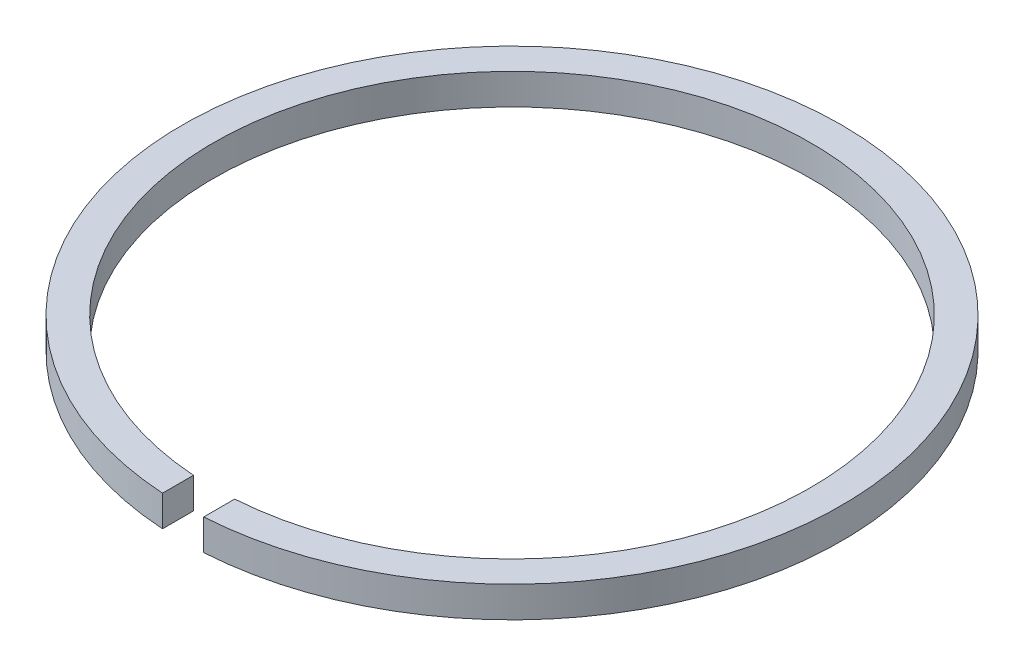
ISO-10303-21;
HEADER;
FILE_DESCRIPTION(('STEP AP214'),'2;1');
FILE_NAME('part.step','',(''),(''),'','','');
FILE_SCHEMA(('AUTOMOTIVE_DESIGN { 1 0 10303 214 1 1 1 1 }'));
ENDSEC;
DATA;
#1=APPLICATION_CONTEXT('core data for automotive mechanical design processes');
#2=APPLICATION_PROTOCOL_DEFINITION('international standard','automotive_design',2000,#1);
#3=PRODUCT_CONTEXT('',#1,'mechanical');
#4=PRODUCT('Part','Part','',(#3));
#5=PRODUCT_RELATED_PRODUCT_CATEGORY('part','',(#4));
#6=PRODUCT_DEFINITION_FORMATION('','',#4);
#7=PRODUCT_DEFINITION_CONTEXT('part definition',#1,'design');
#8=PRODUCT_DEFINITION('design','',#6,#7);
#9=PRODUCT_DEFINITION_SHAPE('','',#8);
#10=(LENGTH_UNIT() NAMED_UNIT(*) SI_UNIT(.MILLI.,.METRE.));
#11=(NAMED_UNIT(*) PLANE_ANGLE_UNIT() SI_UNIT($,.RADIAN.));
#12=(NAMED_UNIT(*) SI_UNIT($,.STERADIAN.) SOLID_ANGLE_UNIT());
#13=UNCERTAINTY_MEASURE_WITH_UNIT(LENGTH_MEASURE(1.E-05),#10,'distance_accuracy_value','');
#14=(GEOMETRIC_REPRESENTATION_CONTEXT(3) GLOBAL_UNCERTAINTY_ASSIGNED_CONTEXT((#13)) GLOBAL_UNIT_ASSIGNED_CONTEXT((#10,
#11,#12)) REPRESENTATION_CONTEXT('',''));
#15=CARTESIAN_POINT('',(0.,0.,0.));
#16=DIRECTION('',(0.,0.,1.));
#17=DIRECTION('',(1.,0.,0.));
#18=AXIS2_PLACEMENT_3D('',#15,#16,#17);
#19=CARTESIAN_POINT('',(0.,0.75,0.));
#20=DIRECTION('',(0.,1.,0.));
#21=DIRECTION('',(0.,0.,1.));
#22=AXIS2_PLACEMENT_3D('',#19,#20,#21);
#23=PLANE('',#22);
#24=DIRECTION('',(0.,0.,1.));
#25=VECTOR('',#24,1.);
#26=CARTESIAN_POINT('',(-1.,0.75,13.5024239411815));
#27=LINE('',#26,#25);
#28=CARTESIAN_POINT('',(-1.,0.75,14.4654761414894));
#29=VERTEX_POINT('',#28);
#30=CARTESIAN_POINT('',(-1.,0.75,15.9687194226713));
#31=VERTEX_POINT('',#30);
#32=EDGE_CURVE('E89',#29,#31,#27,.T.);
#33=ORIENTED_EDGE('',*,*,#32,.F.);
#34=CARTESIAN_POINT('',(0.,0.75,0.));
#35=DIRECTION('',(0.,1.,0.));
#36=DIRECTION('',(0.,0.,1.));
#37=AXIS2_PLACEMENT_3D('',#34,#35,#36);
#38=CIRCLE('',#37,14.5);
#39=CARTESIAN_POINT('',(1.,0.75,14.4654761414894));
#40=VERTEX_POINT('',#39);
#41=EDGE_CURVE('E98',#40,#29,#38,.T.);
#42=ORIENTED_EDGE('',*,*,#41,.F.);
#43=DIRECTION('',(0.,0.,-1.));
#44=VECTOR('',#43,1.);
#45=CARTESIAN_POINT('',(1.,0.75,13.5024239411815));
#46=LINE('',#45,#44);
#47=CARTESIAN_POINT('',(1.,0.75,15.9687194226713));
#48=VERTEX_POINT('',#47);
#49=EDGE_CURVE('E71',#48,#40,#46,.T.);
#50=ORIENTED_EDGE('',*,*,#49,.F.);
#51=CARTESIAN_POINT('',(0.,0.75,0.));
#52=DIRECTION('',(0.,1.,0.));
#53=DIRECTION('',(0.,0.,1.));
#54=AXIS2_PLACEMENT_3D('',#51,#52,#53);
#55=CIRCLE('',#54,16.);
#56=EDGE_CURVE('E100',#48,#31,#55,.T.);
#57=ORIENTED_EDGE('',*,*,#56,.T.);
#58=EDGE_LOOP('',(#33,#42,#50,#57));
#59=FACE_BOUND('',#58,.T.);
#60=ADVANCED_FACE('F43',(#59),#23,.T.);
#61=CARTESIAN_POINT('',(0.,-0.75,0.));
#62=DIRECTION('',(0.,1.,0.));
#63=DIRECTION('',(0.,0.,1.));
#64=AXIS2_PLACEMENT_3D('',#61,#62,#63);
#65=PLANE('',#64);
#66=CARTESIAN_POINT('',(0.,-0.75,0.));
#67=DIRECTION('',(0.,1.,0.));
#68=DIRECTION('',(0.,0.,1.));
#69=AXIS2_PLACEMENT_3D('',#66,#67,#68);
#70=CIRCLE('',#69,14.5);
#71=CARTESIAN_POINT('',(1.,-0.75,14.4654761414894));
#72=VERTEX_POINT('',#71);
#73=CARTESIAN_POINT('',(-1.,-0.75,14.4654761414894));
#74=VERTEX_POINT('',#73);
#75=EDGE_CURVE('E106',#72,#74,#70,.T.);
#76=ORIENTED_EDGE('',*,*,#75,.T.);
#77=DIRECTION('',(0.,0.,1.));
#78=VECTOR('',#77,1.);
#79=CARTESIAN_POINT('',(-1.,-0.75,13.5024239411815));
#80=LINE('',#79,#78);
#81=CARTESIAN_POINT('',(-1.,-0.75,15.9687194226713));
#82=VERTEX_POINT('',#81);
#83=EDGE_CURVE('E60',#74,#82,#80,.T.);
#84=ORIENTED_EDGE('',*,*,#83,.T.);
#85=CARTESIAN_POINT('',(0.,-0.75,0.));
#86=DIRECTION('',(0.,1.,0.));
#87=DIRECTION('',(0.,0.,1.));
#88=AXIS2_PLACEMENT_3D('',#85,#86,#87);
#89=CIRCLE('',#88,16.);
#90=CARTESIAN_POINT('',(1.,-0.75,15.9687194226713));
#91=VERTEX_POINT('',#90);
#92=EDGE_CURVE('E105',#91,#82,#89,.T.);
#93=ORIENTED_EDGE('',*,*,#92,.F.);
#94=DIRECTION('',(0.,0.,-1.));
#95=VECTOR('',#94,1.);
#96=CARTESIAN_POINT('',(1.,-0.75,13.5024239411815));
#97=LINE('',#96,#95);
#98=EDGE_CURVE('E121',#91,#72,#97,.T.);
#99=ORIENTED_EDGE('',*,*,#98,.T.);
#100=EDGE_LOOP('',(#76,#84,#93,#99));
#101=FACE_BOUND('',#100,.T.);
#102=ADVANCED_FACE('F125',(#101),#65,.F.);
#103=CARTESIAN_POINT('',(0.,0.75,0.));
#104=DIRECTION('',(0.,-1.,0.));
#105=DIRECTION('',(0.,0.,-1.));
#106=AXIS2_PLACEMENT_3D('',#103,#104,#105);
#107=CYLINDRICAL_SURFACE('',#106,16.);
#108=ORIENTED_EDGE('',*,*,#92,.T.);
#109=DIRECTION('',(0.,-1.,0.));
#110=VECTOR('',#109,1.);
#111=CARTESIAN_POINT('',(-1.,0.75,15.9687194226713));
#112=LINE('',#111,#110);
#113=EDGE_CURVE('E112',#82,#31,#112,.F.);
#114=ORIENTED_EDGE('',*,*,#113,.T.);
#115=ORIENTED_EDGE('',*,*,#56,.F.);
#116=DIRECTION('',(0.,-1.,0.));
#117=VECTOR('',#116,1.);
#118=CARTESIAN_POINT('',(1.,0.75,15.9687194226713));
#119=LINE('',#118,#117);
#120=EDGE_CURVE('E127',#48,#91,#119,.T.);
#121=ORIENTED_EDGE('',*,*,#120,.T.);
#122=EDGE_LOOP('',(#108,#114,#115,#121));
#123=FACE_BOUND('',#122,.T.);
#124=ADVANCED_FACE('F45',(#123),#107,.T.);
#125=CARTESIAN_POINT('',(0.,0.75,0.));
#126=DIRECTION('',(0.,-1.,0.));
#127=DIRECTION('',(0.,0.,-1.));
#128=AXIS2_PLACEMENT_3D('',#125,#126,#127);
#129=CYLINDRICAL_SURFACE('',#128,14.5);
#130=DIRECTION('',(0.,-1.,0.));
#131=VECTOR('',#130,1.);
#132=CARTESIAN_POINT('',(-1.,0.75,14.4654761414894));
#133=LINE('',#132,#131);
#134=EDGE_CURVE('E11',#74,#29,#133,.F.);
#135=ORIENTED_EDGE('',*,*,#134,.F.);
#136=ORIENTED_EDGE('',*,*,#75,.F.);
#137=DIRECTION('',(0.,-1.,0.));
#138=VECTOR('',#137,1.);
#139=CARTESIAN_POINT('',(1.,0.75,14.4654761414894));
#140=LINE('',#139,#138);
#141=EDGE_CURVE('E52',#40,#72,#140,.T.);
#142=ORIENTED_EDGE('',*,*,#141,.F.);
#143=ORIENTED_EDGE('',*,*,#41,.T.);
#144=EDGE_LOOP('',(#135,#136,#142,#143));
#145=FACE_BOUND('',#144,.T.);
#146=ADVANCED_FACE('F103',(#145),#129,.F.);
#147=CARTESIAN_POINT('',(1.,-0.75,13.5024239411815));
#148=DIRECTION('',(1.,0.,0.));
#149=DIRECTION('',(0.,0.,-1.));
#150=AXIS2_PLACEMENT_3D('',#147,#148,#149);
#151=PLANE('',#150);
#152=ORIENTED_EDGE('',*,*,#49,.T.);
#153=ORIENTED_EDGE('',*,*,#141,.T.);
#154=ORIENTED_EDGE('',*,*,#98,.F.);
#155=ORIENTED_EDGE('',*,*,#120,.F.);
#156=EDGE_LOOP('',(#152,#153,#154,#155));
#157=FACE_BOUND('',#156,.T.);
#158=ADVANCED_FACE('F120',(#157),#151,.F.);
#159=CARTESIAN_POINT('',(-1.,-0.75,13.5024239411815));
#160=DIRECTION('',(-1.,0.,0.));
#161=DIRECTION('',(0.,0.,1.));
#162=AXIS2_PLACEMENT_3D('',#159,#160,#161);
#163=PLANE('',#162);
#164=ORIENTED_EDGE('',*,*,#83,.F.);
#165=ORIENTED_EDGE('',*,*,#134,.T.);
#166=ORIENTED_EDGE('',*,*,#32,.T.);
#167=ORIENTED_EDGE('',*,*,#113,.F.);
#168=EDGE_LOOP('',(#164,#165,#166,#167));
#169=FACE_BOUND('',#168,.T.);
#170=ADVANCED_FACE('F88',(#169),#163,.F.);
#171=CLOSED_SHELL('',(#60,#102,#124,#146,#158,#170));
#172=MANIFOLD_SOLID_BREP('B2',#171);
#173=ADVANCED_BREP_SHAPE_REPRESENTATION('',(#18,#172),#14);
#174=SHAPE_DEFINITION_REPRESENTATION(#9,#173);
ENDSEC;
END-ISO-10303-21;
